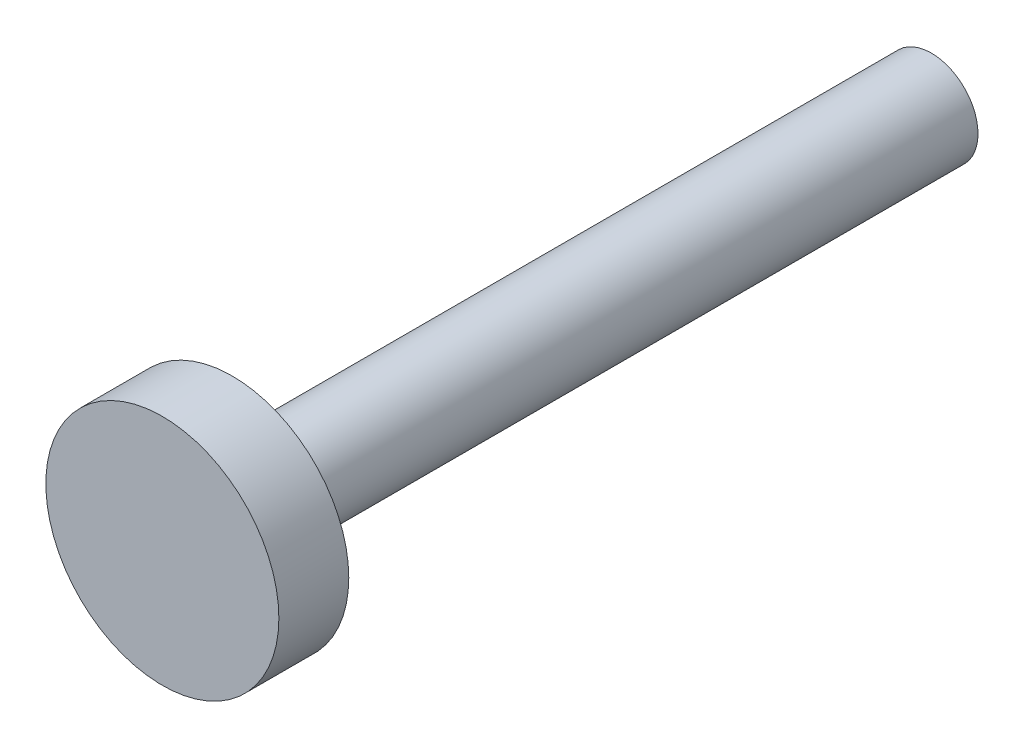
ISO-10303-21;
HEADER;
FILE_DESCRIPTION(('STEP AP214'),'2;1');
FILE_NAME('part.step','',(''),(''),'','','');
FILE_SCHEMA(('AUTOMOTIVE_DESIGN { 1 0 10303 214 1 1 1 1 }'));
ENDSEC;
DATA;
#1=APPLICATION_CONTEXT('core data for automotive mechanical design processes');
#2=APPLICATION_PROTOCOL_DEFINITION('international standard','automotive_design',2000,#1);
#3=PRODUCT_CONTEXT('',#1,'mechanical');
#4=PRODUCT('Part','Part','',(#3));
#5=PRODUCT_RELATED_PRODUCT_CATEGORY('part','',(#4));
#6=PRODUCT_DEFINITION_FORMATION('','',#4);
#7=PRODUCT_DEFINITION_CONTEXT('part definition',#1,'design');
#8=PRODUCT_DEFINITION('design','',#6,#7);
#9=PRODUCT_DEFINITION_SHAPE('','',#8);
#10=(LENGTH_UNIT() NAMED_UNIT(*) SI_UNIT(.MILLI.,.METRE.));
#11=(NAMED_UNIT(*) PLANE_ANGLE_UNIT() SI_UNIT($,.RADIAN.));
#12=(NAMED_UNIT(*) SI_UNIT($,.STERADIAN.) SOLID_ANGLE_UNIT());
#13=UNCERTAINTY_MEASURE_WITH_UNIT(LENGTH_MEASURE(1.E-05),#10,'distance_accuracy_value','');
#14=(GEOMETRIC_REPRESENTATION_CONTEXT(3) GLOBAL_UNCERTAINTY_ASSIGNED_CONTEXT((#13)) GLOBAL_UNIT_ASSIGNED_CONTEXT((#10,
#11,#12)) REPRESENTATION_CONTEXT('',''));
#15=CARTESIAN_POINT('',(0.,0.,0.));
#16=DIRECTION('',(0.,0.,1.));
#17=DIRECTION('',(1.,0.,0.));
#18=AXIS2_PLACEMENT_3D('',#15,#16,#17);
#19=CARTESIAN_POINT('',(0.,0.,30.));
#20=DIRECTION('',(0.,0.,-1.));
#21=DIRECTION('',(-1.,0.,0.));
#22=AXIS2_PLACEMENT_3D('',#19,#20,#21);
#23=CYLINDRICAL_SURFACE('',#22,2.);
#24=CARTESIAN_POINT('',(0.,0.,30.));
#25=DIRECTION('',(0.,0.,1.));
#26=DIRECTION('',(1.,0.,0.));
#27=AXIS2_PLACEMENT_3D('',#24,#25,#26);
#28=CIRCLE('',#27,2.);
#29=CARTESIAN_POINT('',(2.,0.,30.));
#30=VERTEX_POINT('',#29);
#31=EDGE_CURVE('E10',#30,#30,#28,.T.);
#32=ORIENTED_EDGE('',*,*,#31,.F.);
#33=EDGE_LOOP('',(#32));
#34=FACE_BOUND('',#33,.T.);
#35=CARTESIAN_POINT('',(0.,0.,0.));
#36=DIRECTION('',(0.,0.,1.));
#37=DIRECTION('',(1.,0.,0.));
#38=AXIS2_PLACEMENT_3D('',#35,#36,#37);
#39=CIRCLE('',#38,2.);
#40=CARTESIAN_POINT('',(2.,0.,0.));
#41=VERTEX_POINT('',#40);
#42=EDGE_CURVE('E40',#41,#41,#39,.T.);
#43=ORIENTED_EDGE('',*,*,#42,.T.);
#44=EDGE_LOOP('',(#43));
#45=FACE_BOUND('',#44,.T.);
#46=ADVANCED_FACE('F37',(#34,#45),#23,.T.);
#47=CARTESIAN_POINT('',(0.,0.,0.));
#48=DIRECTION('',(0.,0.,1.));
#49=DIRECTION('',(1.,0.,0.));
#50=AXIS2_PLACEMENT_3D('',#47,#48,#49);
#51=PLANE('',#50);
#52=ORIENTED_EDGE('',*,*,#42,.F.);
#53=EDGE_LOOP('',(#52));
#54=FACE_BOUND('',#53,.T.);
#55=ADVANCED_FACE('F64',(#54),#51,.F.);
#56=CARTESIAN_POINT('',(0.,0.,33.));
#57=DIRECTION('',(0.,0.,-1.));
#58=DIRECTION('',(-1.,0.,0.));
#59=AXIS2_PLACEMENT_3D('',#56,#57,#58);
#60=CYLINDRICAL_SURFACE('',#59,5.);
#61=CARTESIAN_POINT('',(0.,0.,33.));
#62=DIRECTION('',(0.,0.,1.));
#63=DIRECTION('',(1.,0.,0.));
#64=AXIS2_PLACEMENT_3D('',#61,#62,#63);
#65=CIRCLE('',#64,5.);
#66=CARTESIAN_POINT('',(5.,0.,33.));
#67=VERTEX_POINT('',#66);
#68=EDGE_CURVE('E49',#67,#67,#65,.T.);
#69=ORIENTED_EDGE('',*,*,#68,.F.);
#70=EDGE_LOOP('',(#69));
#71=FACE_BOUND('',#70,.T.);
#72=CARTESIAN_POINT('',(0.,0.,30.));
#73=DIRECTION('',(0.,0.,1.));
#74=DIRECTION('',(1.,0.,0.));
#75=AXIS2_PLACEMENT_3D('',#72,#73,#74);
#76=CIRCLE('',#75,5.);
#77=CARTESIAN_POINT('',(5.,0.,30.));
#78=VERTEX_POINT('',#77);
#79=EDGE_CURVE('E51',#78,#78,#76,.T.);
#80=ORIENTED_EDGE('',*,*,#79,.T.);
#81=EDGE_LOOP('',(#80));
#82=FACE_BOUND('',#81,.T.);
#83=ADVANCED_FACE('F61',(#71,#82),#60,.T.);
#84=CARTESIAN_POINT('',(0.,0.,33.));
#85=DIRECTION('',(0.,0.,1.));
#86=DIRECTION('',(1.,0.,0.));
#87=AXIS2_PLACEMENT_3D('',#84,#85,#86);
#88=PLANE('',#87);
#89=ORIENTED_EDGE('',*,*,#68,.T.);
#90=EDGE_LOOP('',(#89));
#91=FACE_BOUND('',#90,.T.);
#92=ADVANCED_FACE('F59',(#91),#88,.T.);
#93=CARTESIAN_POINT('',(0.,0.,30.));
#94=DIRECTION('',(0.,0.,1.));
#95=DIRECTION('',(1.,0.,0.));
#96=AXIS2_PLACEMENT_3D('',#93,#94,#95);
#97=PLANE('',#96);
#98=ORIENTED_EDGE('',*,*,#31,.T.);
#99=EDGE_LOOP('',(#98));
#100=FACE_BOUND('',#99,.T.);
#101=ORIENTED_EDGE('',*,*,#79,.F.);
#102=EDGE_LOOP('',(#101));
#103=FACE_BOUND('',#102,.T.);
#104=ADVANCED_FACE('F68',(#100,#103),#97,.F.);
#105=CLOSED_SHELL('',(#46,#55,#83,#92,#104));
#106=MANIFOLD_SOLID_BREP('B2',#105);
#107=ADVANCED_BREP_SHAPE_REPRESENTATION('',(#18,#106),#14);
#108=SHAPE_DEFINITION_REPRESENTATION(#9,#107);
ENDSEC;
END-ISO-10303-21;
